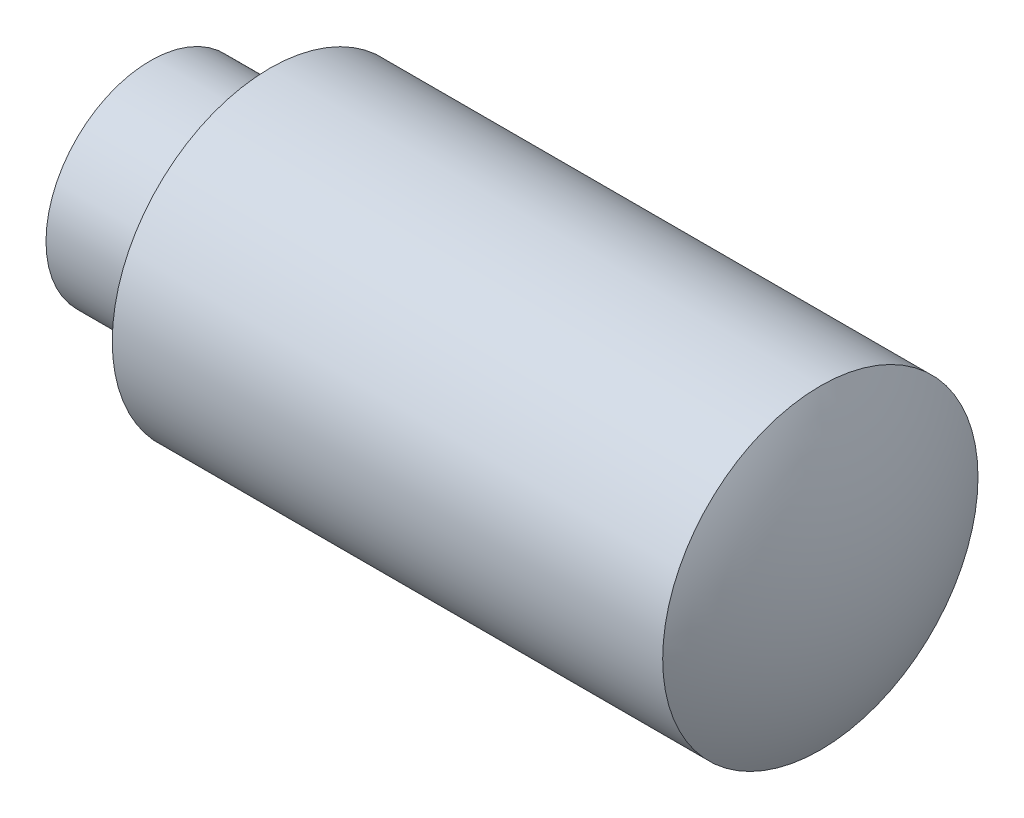
ISO-10303-21;
HEADER;
FILE_DESCRIPTION(('STEP AP214'),'2;1');
FILE_NAME('part.step','',(''),(''),'','','');
FILE_SCHEMA(('AUTOMOTIVE_DESIGN { 1 0 10303 214 1 1 1 1 }'));
ENDSEC;
DATA;
#1=APPLICATION_CONTEXT('core data for automotive mechanical design processes');
#2=APPLICATION_PROTOCOL_DEFINITION('international standard','automotive_design',2000,#1);
#3=PRODUCT_CONTEXT('',#1,'mechanical');
#4=PRODUCT('Part','Part','',(#3));
#5=PRODUCT_RELATED_PRODUCT_CATEGORY('part','',(#4));
#6=PRODUCT_DEFINITION_FORMATION('','',#4);
#7=PRODUCT_DEFINITION_CONTEXT('part definition',#1,'design');
#8=PRODUCT_DEFINITION('design','',#6,#7);
#9=PRODUCT_DEFINITION_SHAPE('','',#8);
#10=(LENGTH_UNIT() NAMED_UNIT(*) SI_UNIT(.MILLI.,.METRE.));
#11=(NAMED_UNIT(*) PLANE_ANGLE_UNIT() SI_UNIT($,.RADIAN.));
#12=(NAMED_UNIT(*) SI_UNIT($,.STERADIAN.) SOLID_ANGLE_UNIT());
#13=UNCERTAINTY_MEASURE_WITH_UNIT(LENGTH_MEASURE(1.E-05),#10,'distance_accuracy_value','');
#14=(GEOMETRIC_REPRESENTATION_CONTEXT(3) GLOBAL_UNCERTAINTY_ASSIGNED_CONTEXT((#13)) GLOBAL_UNIT_ASSIGNED_CONTEXT((#10,
#11,#12)) REPRESENTATION_CONTEXT('',''));
#15=CARTESIAN_POINT('',(0.,0.,0.));
#16=DIRECTION('',(0.,0.,1.));
#17=DIRECTION('',(1.,0.,0.));
#18=AXIS2_PLACEMENT_3D('',#15,#16,#17);
#19=CARTESIAN_POINT('',(0.415809,0.,0.));
#20=DIRECTION('',(-1.,0.,0.));
#21=DIRECTION('',(0.,1.,0.));
#22=AXIS2_PLACEMENT_3D('',#19,#20,#21);
#23=SPHERICAL_SURFACE('',#22,2.104809);
#24=CARTESIAN_POINT('',(2.24183186484178,0.,0.));
#25=DIRECTION('',(-1.,0.,0.));
#26=DIRECTION('',(0.,0.,1.));
#27=AXIS2_PLACEMENT_3D('',#24,#25,#26);
#28=CIRCLE('',#27,1.046834);
#29=CARTESIAN_POINT('',(2.24183186484178,0.,1.046834));
#30=VERTEX_POINT('',#29);
#31=EDGE_CURVE('E10',#30,#30,#28,.T.);
#32=ORIENTED_EDGE('',*,*,#31,.F.);
#33=EDGE_LOOP('',(#32));
#34=FACE_BOUND('',#33,.T.);
#35=ADVANCED_FACE('F33',(#34),#23,.T.);
#36=CARTESIAN_POINT('',(-1.065618,0.,0.));
#37=DIRECTION('',(-1.,0.,0.));
#38=DIRECTION('',(0.,0.,1.));
#39=AXIS2_PLACEMENT_3D('',#36,#37,#38);
#40=CYLINDRICAL_SURFACE('',#39,1.046834);
#41=CARTESIAN_POINT('',(-1.41290883511403,0.,0.));
#42=DIRECTION('',(-1.,0.,0.));
#43=DIRECTION('',(0.,0.,1.));
#44=AXIS2_PLACEMENT_3D('',#41,#42,#43);
#45=CIRCLE('',#44,1.046834);
#46=CARTESIAN_POINT('',(-1.41290883511403,0.,1.046834));
#47=VERTEX_POINT('',#46);
#48=EDGE_CURVE('E39',#47,#47,#45,.T.);
#49=ORIENTED_EDGE('',*,*,#48,.F.);
#50=EDGE_LOOP('',(#49));
#51=FACE_BOUND('',#50,.T.);
#52=ORIENTED_EDGE('',*,*,#31,.T.);
#53=EDGE_LOOP('',(#52));
#54=FACE_BOUND('',#53,.T.);
#55=ADVANCED_FACE('F72',(#51,#54),#40,.T.);
#56=CARTESIAN_POINT('',(-1.41290883511403,0.,0.));
#57=DIRECTION('',(1.,0.,0.));
#58=DIRECTION('',(0.,0.,-1.));
#59=AXIS2_PLACEMENT_3D('',#56,#57,#58);
#60=PLANE('',#59);
#61=CARTESIAN_POINT('',(-1.41290883511403,0.,0.));
#62=DIRECTION('',(-1.,0.,0.));
#63=DIRECTION('',(0.,0.,1.));
#64=AXIS2_PLACEMENT_3D('',#61,#62,#63);
#65=CIRCLE('',#64,0.692863);
#66=CARTESIAN_POINT('',(-1.41290883511403,0.,0.692863));
#67=VERTEX_POINT('',#66);
#68=EDGE_CURVE('E43',#67,#67,#65,.T.);
#69=ORIENTED_EDGE('',*,*,#68,.F.);
#70=EDGE_LOOP('',(#69));
#71=FACE_BOUND('',#70,.T.);
#72=ORIENTED_EDGE('',*,*,#48,.T.);
#73=EDGE_LOOP('',(#72));
#74=FACE_BOUND('',#73,.T.);
#75=ADVANCED_FACE('F70',(#71,#74),#60,.F.);
#76=CARTESIAN_POINT('',(0.,0.,0.));
#77=DIRECTION('',(-1.,0.,0.));
#78=DIRECTION('',(0.,1.,0.));
#79=AXIS2_PLACEMENT_3D('',#76,#77,#78);
#80=SPHERICAL_SURFACE('',#79,2.306163);
#81=CARTESIAN_POINT('',(-2.20680723612372,0.,0.));
#82=DIRECTION('',(-1.,0.,0.));
#83=DIRECTION('',(0.,0.,1.));
#84=AXIS2_PLACEMENT_3D('',#81,#82,#83);
#85=CIRCLE('',#84,0.669619);
#86=CARTESIAN_POINT('',(-2.20680723612372,0.,0.669619));
#87=VERTEX_POINT('',#86);
#88=EDGE_CURVE('E52',#87,#87,#85,.T.);
#89=ORIENTED_EDGE('',*,*,#88,.T.);
#90=EDGE_LOOP('',(#89));
#91=FACE_BOUND('',#90,.T.);
#92=ADVANCED_FACE('F56',(#91),#80,.T.);
#93=CARTESIAN_POINT('',(-2.306163,0.,0.));
#94=DIRECTION('',(-1.,0.,0.));
#95=DIRECTION('',(0.,0.,1.));
#96=AXIS2_PLACEMENT_3D('',#93,#94,#95);
#97=CYLINDRICAL_SURFACE('',#96,0.692863);
#98=CARTESIAN_POINT('',(-2.20680723612372,0.,0.));
#99=DIRECTION('',(-1.,0.,0.));
#100=DIRECTION('',(0.,0.,1.));
#101=AXIS2_PLACEMENT_3D('',#98,#99,#100);
#102=CIRCLE('',#101,0.692863);
#103=CARTESIAN_POINT('',(-2.20680723612372,0.,0.692863));
#104=VERTEX_POINT('',#103);
#105=EDGE_CURVE('E47',#104,#104,#102,.T.);
#106=ORIENTED_EDGE('',*,*,#105,.F.);
#107=EDGE_LOOP('',(#106));
#108=FACE_BOUND('',#107,.T.);
#109=ORIENTED_EDGE('',*,*,#68,.T.);
#110=EDGE_LOOP('',(#109));
#111=FACE_BOUND('',#110,.T.);
#112=ADVANCED_FACE('F61',(#108,#111),#97,.T.);
#113=CARTESIAN_POINT('',(-2.20680723612372,0.,0.));
#114=DIRECTION('',(1.,0.,0.));
#115=DIRECTION('',(0.,0.,-1.));
#116=AXIS2_PLACEMENT_3D('',#113,#114,#115);
#117=PLANE('',#116);
#118=ORIENTED_EDGE('',*,*,#88,.F.);
#119=EDGE_LOOP('',(#118));
#120=FACE_BOUND('',#119,.T.);
#121=ORIENTED_EDGE('',*,*,#105,.T.);
#122=EDGE_LOOP('',(#121));
#123=FACE_BOUND('',#122,.T.);
#124=ADVANCED_FACE('F58',(#120,#123),#117,.F.);
#125=CLOSED_SHELL('',(#35,#55,#75,#92,#112,#124));
#126=MANIFOLD_SOLID_BREP('B2',#125);
#127=ADVANCED_BREP_SHAPE_REPRESENTATION('',(#18,#126),#14);
#128=SHAPE_DEFINITION_REPRESENTATION(#9,#127);
ENDSEC;
END-ISO-10303-21;
